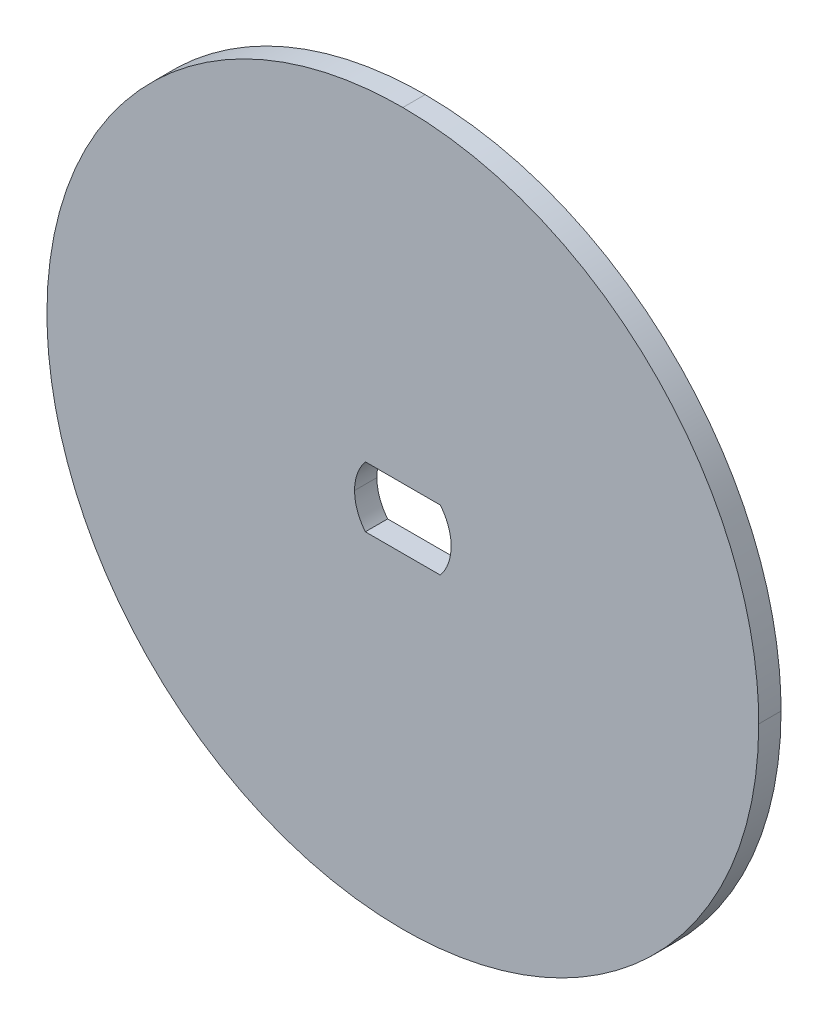
ISO-10303-21;
HEADER;
FILE_DESCRIPTION(('STEP AP214'),'2;1');
FILE_NAME('part.step','',(''),(''),'','','');
FILE_SCHEMA(('AUTOMOTIVE_DESIGN { 1 0 10303 214 1 1 1 1 }'));
ENDSEC;
DATA;
#1=APPLICATION_CONTEXT('core data for automotive mechanical design processes');
#2=APPLICATION_PROTOCOL_DEFINITION('international standard','automotive_design',2000,#1);
#3=PRODUCT_CONTEXT('',#1,'mechanical');
#4=PRODUCT('Part','Part','',(#3));
#5=PRODUCT_RELATED_PRODUCT_CATEGORY('part','',(#4));
#6=PRODUCT_DEFINITION_FORMATION('','',#4);
#7=PRODUCT_DEFINITION_CONTEXT('part definition',#1,'design');
#8=PRODUCT_DEFINITION('design','',#6,#7);
#9=PRODUCT_DEFINITION_SHAPE('','',#8);
#10=(LENGTH_UNIT() NAMED_UNIT(*) SI_UNIT(.MILLI.,.METRE.));
#11=(NAMED_UNIT(*) PLANE_ANGLE_UNIT() SI_UNIT($,.RADIAN.));
#12=(NAMED_UNIT(*) SI_UNIT($,.STERADIAN.) SOLID_ANGLE_UNIT());
#13=UNCERTAINTY_MEASURE_WITH_UNIT(LENGTH_MEASURE(1.E-05),#10,'distance_accuracy_value','');
#14=(GEOMETRIC_REPRESENTATION_CONTEXT(3) GLOBAL_UNCERTAINTY_ASSIGNED_CONTEXT((#13)) GLOBAL_UNIT_ASSIGNED_CONTEXT((#10,
#11,#12)) REPRESENTATION_CONTEXT('',''));
#15=CARTESIAN_POINT('',(0.,0.,0.));
#16=DIRECTION('',(0.,0.,1.));
#17=DIRECTION('',(1.,0.,0.));
#18=AXIS2_PLACEMENT_3D('',#15,#16,#17);
#19=CARTESIAN_POINT('',(50.012832,180.595493,1.5875));
#20=CARTESIAN_POINT('',(63.995642,180.595493,1.5875));
#21=CARTESIAN_POINT('',(75.330974,169.260162,1.5875));
#22=CARTESIAN_POINT('',(75.330974,155.277352,1.5875));
#23=B_SPLINE_CURVE_WITH_KNOTS('',3,(#19,#20,#21,#22),.UNSPECIFIED.,.F.,.F.,(4,4),(0.,1.),.UNSPECIFIED.);
#24=DIRECTION('',(0.,0.,-1.));
#25=VECTOR('',#24,1.);
#26=SURFACE_OF_LINEAR_EXTRUSION('',#23,#25);
#27=CARTESIAN_POINT('',(50.012832,180.595493,0.));
#28=CARTESIAN_POINT('',(63.995642,180.595493,0.));
#29=CARTESIAN_POINT('',(75.330974,169.260162,0.));
#30=CARTESIAN_POINT('',(75.330974,155.277352,0.));
#31=B_SPLINE_CURVE_WITH_KNOTS('',3,(#27,#28,#29,#30),.UNSPECIFIED.,.F.,.F.,(4,4),(0.,1.),.UNSPECIFIED.);
#32=CARTESIAN_POINT('',(50.012832,180.595493,0.));
#33=VERTEX_POINT('',#32);
#34=CARTESIAN_POINT('',(75.330974,155.277352,0.));
#35=VERTEX_POINT('',#34);
#36=EDGE_CURVE('E264',#33,#35,#31,.T.);
#37=ORIENTED_EDGE('',*,*,#36,.F.);
#38=DIRECTION('',(0.,0.,-1.));
#39=VECTOR('',#38,1.);
#40=CARTESIAN_POINT('',(50.012832,180.595493,1.5875));
#41=LINE('',#40,#39);
#42=CARTESIAN_POINT('',(50.012832,180.595493,1.5875));
#43=VERTEX_POINT('',#42);
#44=EDGE_CURVE('E11',#43,#33,#41,.T.);
#45=ORIENTED_EDGE('',*,*,#44,.F.);
#46=CARTESIAN_POINT('',(75.330974,155.277352,1.5875));
#47=VERTEX_POINT('',#46);
#48=EDGE_CURVE('E133',#43,#47,#23,.T.);
#49=ORIENTED_EDGE('',*,*,#48,.T.);
#50=DIRECTION('',(0.,0.,-1.));
#51=VECTOR('',#50,1.);
#52=CARTESIAN_POINT('',(75.330974,155.277352,1.5875));
#53=LINE('',#52,#51);
#54=EDGE_CURVE('E53',#47,#35,#53,.T.);
#55=ORIENTED_EDGE('',*,*,#54,.T.);
#56=EDGE_LOOP('',(#37,#45,#49,#55));
#57=FACE_BOUND('',#56,.T.);
#58=ADVANCED_FACE('F33',(#57),#26,.T.);
#59=CARTESIAN_POINT('',(24.694691,155.277352,1.5875));
#60=CARTESIAN_POINT('',(24.694691,169.260162,1.5875));
#61=CARTESIAN_POINT('',(36.029994,180.595493,1.5875));
#62=CARTESIAN_POINT('',(50.012832,180.595493,1.5875));
#63=B_SPLINE_CURVE_WITH_KNOTS('',3,(#59,#60,#61,#62),.UNSPECIFIED.,.F.,.F.,(4,4),(0.,1.),.UNSPECIFIED.);
#64=DIRECTION('',(0.,0.,-1.));
#65=VECTOR('',#64,1.);
#66=SURFACE_OF_LINEAR_EXTRUSION('',#63,#65);
#67=CARTESIAN_POINT('',(24.694691,155.277352,0.));
#68=CARTESIAN_POINT('',(24.694691,169.260162,0.));
#69=CARTESIAN_POINT('',(36.029994,180.595493,0.));
#70=CARTESIAN_POINT('',(50.012832,180.595493,0.));
#71=B_SPLINE_CURVE_WITH_KNOTS('',3,(#67,#68,#69,#70),.UNSPECIFIED.,.F.,.F.,(4,4),(0.,1.),.UNSPECIFIED.);
#72=CARTESIAN_POINT('',(24.694691,155.277352,0.));
#73=VERTEX_POINT('',#72);
#74=EDGE_CURVE('E122',#73,#33,#71,.T.);
#75=ORIENTED_EDGE('',*,*,#74,.F.);
#76=DIRECTION('',(0.,0.,-1.));
#77=VECTOR('',#76,1.);
#78=CARTESIAN_POINT('',(24.694691,155.277352,1.5875));
#79=LINE('',#78,#77);
#80=CARTESIAN_POINT('',(24.694691,155.277352,1.5875));
#81=VERTEX_POINT('',#80);
#82=EDGE_CURVE('E44',#81,#73,#79,.T.);
#83=ORIENTED_EDGE('',*,*,#82,.F.);
#84=EDGE_CURVE('E120',#81,#43,#63,.T.);
#85=ORIENTED_EDGE('',*,*,#84,.T.);
#86=ORIENTED_EDGE('',*,*,#44,.T.);
#87=EDGE_LOOP('',(#75,#83,#85,#86));
#88=FACE_BOUND('',#87,.T.);
#89=ADVANCED_FACE('F119',(#88),#66,.T.);
#90=CARTESIAN_POINT('',(50.012832,129.959211,1.5875));
#91=CARTESIAN_POINT('',(36.029994,129.959211,1.5875));
#92=CARTESIAN_POINT('',(24.694691,141.294514,1.5875));
#93=CARTESIAN_POINT('',(24.694691,155.277352,1.5875));
#94=B_SPLINE_CURVE_WITH_KNOTS('',3,(#90,#91,#92,#93),.UNSPECIFIED.,.F.,.F.,(4,4),(0.,1.),.UNSPECIFIED.);
#95=DIRECTION('',(0.,0.,-1.));
#96=VECTOR('',#95,1.);
#97=SURFACE_OF_LINEAR_EXTRUSION('',#94,#96);
#98=CARTESIAN_POINT('',(50.012832,129.959211,0.));
#99=CARTESIAN_POINT('',(36.029994,129.959211,0.));
#100=CARTESIAN_POINT('',(24.694691,141.294514,0.));
#101=CARTESIAN_POINT('',(24.694691,155.277352,0.));
#102=B_SPLINE_CURVE_WITH_KNOTS('',3,(#98,#99,#100,#101),.UNSPECIFIED.,.F.,.F.,(4,4),(0.,1.),.UNSPECIFIED.);
#103=CARTESIAN_POINT('',(50.012832,129.959211,0.));
#104=VERTEX_POINT('',#103);
#105=EDGE_CURVE('E251',#104,#73,#102,.T.);
#106=ORIENTED_EDGE('',*,*,#105,.F.);
#107=DIRECTION('',(0.,0.,-1.));
#108=VECTOR('',#107,1.);
#109=CARTESIAN_POINT('',(50.012832,129.959211,1.5875));
#110=LINE('',#109,#108);
#111=CARTESIAN_POINT('',(50.012832,129.959211,1.5875));
#112=VERTEX_POINT('',#111);
#113=EDGE_CURVE('E84',#112,#104,#110,.T.);
#114=ORIENTED_EDGE('',*,*,#113,.F.);
#115=EDGE_CURVE('E132',#112,#81,#94,.T.);
#116=ORIENTED_EDGE('',*,*,#115,.T.);
#117=ORIENTED_EDGE('',*,*,#82,.T.);
#118=EDGE_LOOP('',(#106,#114,#116,#117));
#119=FACE_BOUND('',#118,.T.);
#120=ADVANCED_FACE('F135',(#119),#97,.T.);
#121=CARTESIAN_POINT('',(53.448004,155.28176,1.5875));
#122=CARTESIAN_POINT('',(53.448004,156.099908,1.5875));
#123=CARTESIAN_POINT('',(53.158396,156.843852,1.5875));
#124=CARTESIAN_POINT('',(52.680713,157.433705,1.5875));
#125=B_SPLINE_CURVE_WITH_KNOTS('',3,(#121,#122,#123,#124),.UNSPECIFIED.,.F.,.F.,(4,4),(0.,1.),.UNSPECIFIED.);
#126=DIRECTION('',(0.,0.,-1.));
#127=VECTOR('',#126,1.);
#128=SURFACE_OF_LINEAR_EXTRUSION('',#125,#127);
#129=CARTESIAN_POINT('',(53.448004,155.28176,0.));
#130=CARTESIAN_POINT('',(53.448004,156.099908,0.));
#131=CARTESIAN_POINT('',(53.158396,156.843852,0.));
#132=CARTESIAN_POINT('',(52.680713,157.433705,0.));
#133=B_SPLINE_CURVE_WITH_KNOTS('',3,(#129,#130,#131,#132),.UNSPECIFIED.,.F.,.F.,(4,4),(0.,1.),.UNSPECIFIED.);
#134=CARTESIAN_POINT('',(53.448004,155.28176,0.));
#135=VERTEX_POINT('',#134);
#136=CARTESIAN_POINT('',(52.680713,157.433705,0.));
#137=VERTEX_POINT('',#136);
#138=EDGE_CURVE('E297',#135,#137,#133,.T.);
#139=ORIENTED_EDGE('',*,*,#138,.F.);
#140=DIRECTION('',(0.,0.,-1.));
#141=VECTOR('',#140,1.);
#142=CARTESIAN_POINT('',(53.448004,155.28176,1.5875));
#143=LINE('',#142,#141);
#144=CARTESIAN_POINT('',(53.448004,155.28176,1.5875));
#145=VERTEX_POINT('',#144);
#146=EDGE_CURVE('E38',#145,#135,#143,.T.);
#147=ORIENTED_EDGE('',*,*,#146,.F.);
#148=CARTESIAN_POINT('',(52.680713,157.433705,1.5875));
#149=VERTEX_POINT('',#148);
#150=EDGE_CURVE('E211',#145,#149,#125,.T.);
#151=ORIENTED_EDGE('',*,*,#150,.T.);
#152=DIRECTION('',(0.,0.,-1.));
#153=VECTOR('',#152,1.);
#154=CARTESIAN_POINT('',(52.680713,157.433705,1.5875));
#155=LINE('',#154,#153);
#156=EDGE_CURVE('E138',#149,#137,#155,.T.);
#157=ORIENTED_EDGE('',*,*,#156,.T.);
#158=EDGE_LOOP('',(#139,#147,#151,#157));
#159=FACE_BOUND('',#158,.T.);
#160=ADVANCED_FACE('F35',(#159),#128,.T.);
#161=CARTESIAN_POINT('',(52.680713,153.120996,1.5875));
#162=CARTESIAN_POINT('',(53.158396,153.710849,1.5875));
#163=CARTESIAN_POINT('',(53.448004,154.463612,1.5875));
#164=CARTESIAN_POINT('',(53.448004,155.28176,1.5875));
#165=B_SPLINE_CURVE_WITH_KNOTS('',3,(#161,#162,#163,#164),.UNSPECIFIED.,.F.,.F.,(4,4),(0.,1.),.UNSPECIFIED.);
#166=DIRECTION('',(0.,0.,-1.));
#167=VECTOR('',#166,1.);
#168=SURFACE_OF_LINEAR_EXTRUSION('',#165,#167);
#169=CARTESIAN_POINT('',(52.680713,153.120996,0.));
#170=CARTESIAN_POINT('',(53.158396,153.710849,0.));
#171=CARTESIAN_POINT('',(53.448004,154.463612,0.));
#172=CARTESIAN_POINT('',(53.448004,155.28176,0.));
#173=B_SPLINE_CURVE_WITH_KNOTS('',3,(#169,#170,#171,#172),.UNSPECIFIED.,.F.,.F.,(4,4),(0.,1.),.UNSPECIFIED.);
#174=CARTESIAN_POINT('',(52.680713,153.120996,0.));
#175=VERTEX_POINT('',#174);
#176=EDGE_CURVE('E293',#175,#135,#173,.T.);
#177=ORIENTED_EDGE('',*,*,#176,.F.);
#178=DIRECTION('',(0.,0.,-1.));
#179=VECTOR('',#178,1.);
#180=CARTESIAN_POINT('',(52.680713,153.120996,1.5875));
#181=LINE('',#180,#179);
#182=CARTESIAN_POINT('',(52.680713,153.120996,1.5875));
#183=VERTEX_POINT('',#182);
#184=EDGE_CURVE('E241',#183,#175,#181,.T.);
#185=ORIENTED_EDGE('',*,*,#184,.F.);
#186=EDGE_CURVE('E205',#183,#145,#165,.T.);
#187=ORIENTED_EDGE('',*,*,#186,.T.);
#188=ORIENTED_EDGE('',*,*,#146,.T.);
#189=EDGE_LOOP('',(#177,#185,#187,#188));
#190=FACE_BOUND('',#189,.T.);
#191=ADVANCED_FACE('F200',(#190),#168,.T.);
#192=CARTESIAN_POINT('',(0.,153.120996,1.5875));
#193=DIRECTION('',(0.,1.,0.));
#194=DIRECTION('',(0.,0.,1.));
#195=AXIS2_PLACEMENT_3D('',#192,#193,#194);
#196=PLANE('',#195);
#197=DIRECTION('',(1.,0.,0.));
#198=VECTOR('',#197,1.);
#199=CARTESIAN_POINT('',(0.,153.120996,0.));
#200=LINE('',#199,#198);
#201=CARTESIAN_POINT('',(47.344952,153.120996,0.));
#202=VERTEX_POINT('',#201);
#203=EDGE_CURVE('E287',#202,#175,#200,.T.);
#204=ORIENTED_EDGE('',*,*,#203,.F.);
#205=DIRECTION('',(0.,0.,-1.));
#206=VECTOR('',#205,1.);
#207=CARTESIAN_POINT('',(47.344952,153.120996,1.5875));
#208=LINE('',#207,#206);
#209=CARTESIAN_POINT('',(47.344952,153.120996,1.5875));
#210=VERTEX_POINT('',#209);
#211=EDGE_CURVE('E223',#210,#202,#208,.T.);
#212=ORIENTED_EDGE('',*,*,#211,.F.);
#213=DIRECTION('',(1.,0.,0.));
#214=VECTOR('',#213,1.);
#215=CARTESIAN_POINT('',(0.,153.120996,1.5875));
#216=LINE('',#215,#214);
#217=EDGE_CURVE('E210',#210,#183,#216,.T.);
#218=ORIENTED_EDGE('',*,*,#217,.T.);
#219=ORIENTED_EDGE('',*,*,#184,.T.);
#220=EDGE_LOOP('',(#204,#212,#218,#219));
#221=FACE_BOUND('',#220,.T.);
#222=ADVANCED_FACE('F197',(#221),#196,.T.);
#223=CARTESIAN_POINT('',(46.57766,155.28176,1.5875));
#224=CARTESIAN_POINT('',(46.57766,154.463612,1.5875));
#225=CARTESIAN_POINT('',(46.867268,153.710849,1.5875));
#226=CARTESIAN_POINT('',(47.344952,153.120996,1.5875));
#227=B_SPLINE_CURVE_WITH_KNOTS('',3,(#223,#224,#225,#226),.UNSPECIFIED.,.F.,.F.,(4,4),(0.,1.),.UNSPECIFIED.);
#228=DIRECTION('',(0.,0.,-1.));
#229=VECTOR('',#228,1.);
#230=SURFACE_OF_LINEAR_EXTRUSION('',#227,#229);
#231=CARTESIAN_POINT('',(46.57766,155.28176,0.));
#232=CARTESIAN_POINT('',(46.57766,154.463612,0.));
#233=CARTESIAN_POINT('',(46.867268,153.710849,0.));
#234=CARTESIAN_POINT('',(47.344952,153.120996,0.));
#235=B_SPLINE_CURVE_WITH_KNOTS('',3,(#231,#232,#233,#234),.UNSPECIFIED.,.F.,.F.,(4,4),(0.,1.),.UNSPECIFIED.);
#236=CARTESIAN_POINT('',(46.57766,155.28176,0.));
#237=VERTEX_POINT('',#236);
#238=EDGE_CURVE('E279',#237,#202,#235,.T.);
#239=ORIENTED_EDGE('',*,*,#238,.F.);
#240=DIRECTION('',(0.,0.,-1.));
#241=VECTOR('',#240,1.);
#242=CARTESIAN_POINT('',(46.57766,155.28176,1.5875));
#243=LINE('',#242,#241);
#244=CARTESIAN_POINT('',(46.57766,155.28176,1.5875));
#245=VERTEX_POINT('',#244);
#246=EDGE_CURVE('E225',#245,#237,#243,.T.);
#247=ORIENTED_EDGE('',*,*,#246,.F.);
#248=EDGE_CURVE('E182',#245,#210,#227,.T.);
#249=ORIENTED_EDGE('',*,*,#248,.T.);
#250=ORIENTED_EDGE('',*,*,#211,.T.);
#251=EDGE_LOOP('',(#239,#247,#249,#250));
#252=FACE_BOUND('',#251,.T.);
#253=ADVANCED_FACE('F193',(#252),#230,.T.);
#254=CARTESIAN_POINT('',(47.344952,157.433705,1.5875));
#255=CARTESIAN_POINT('',(46.867268,156.843852,1.5875));
#256=CARTESIAN_POINT('',(46.57766,156.099908,1.5875));
#257=CARTESIAN_POINT('',(46.57766,155.28176,1.5875));
#258=B_SPLINE_CURVE_WITH_KNOTS('',3,(#254,#255,#256,#257),.UNSPECIFIED.,.F.,.F.,(4,4),(0.,1.),.UNSPECIFIED.);
#259=DIRECTION('',(0.,0.,-1.));
#260=VECTOR('',#259,1.);
#261=SURFACE_OF_LINEAR_EXTRUSION('',#258,#260);
#262=CARTESIAN_POINT('',(47.344952,157.433705,0.));
#263=CARTESIAN_POINT('',(46.867268,156.843852,0.));
#264=CARTESIAN_POINT('',(46.57766,156.099908,0.));
#265=CARTESIAN_POINT('',(46.57766,155.28176,0.));
#266=B_SPLINE_CURVE_WITH_KNOTS('',3,(#262,#263,#264,#265),.UNSPECIFIED.,.F.,.F.,(4,4),(0.,1.),.UNSPECIFIED.);
#267=CARTESIAN_POINT('',(47.344952,157.433705,0.));
#268=VERTEX_POINT('',#267);
#269=EDGE_CURVE('E233',#268,#237,#266,.T.);
#270=ORIENTED_EDGE('',*,*,#269,.F.);
#271=DIRECTION('',(0.,0.,-1.));
#272=VECTOR('',#271,1.);
#273=CARTESIAN_POINT('',(47.344952,157.433705,1.5875));
#274=LINE('',#273,#272);
#275=CARTESIAN_POINT('',(47.344952,157.433705,1.5875));
#276=VERTEX_POINT('',#275);
#277=EDGE_CURVE('E231',#276,#268,#274,.T.);
#278=ORIENTED_EDGE('',*,*,#277,.F.);
#279=EDGE_CURVE('E176',#276,#245,#258,.T.);
#280=ORIENTED_EDGE('',*,*,#279,.T.);
#281=ORIENTED_EDGE('',*,*,#246,.T.);
#282=EDGE_LOOP('',(#270,#278,#280,#281));
#283=FACE_BOUND('',#282,.T.);
#284=ADVANCED_FACE('F190',(#283),#261,.T.);
#285=CARTESIAN_POINT('',(0.,157.433705,1.5875));
#286=DIRECTION('',(0.,-1.,0.));
#287=DIRECTION('',(0.,0.,-1.));
#288=AXIS2_PLACEMENT_3D('',#285,#286,#287);
#289=PLANE('',#288);
#290=DIRECTION('',(-1.,0.,0.));
#291=VECTOR('',#290,1.);
#292=CARTESIAN_POINT('',(0.,157.433705,0.));
#293=LINE('',#292,#291);
#294=EDGE_CURVE('E271',#137,#268,#293,.T.);
#295=ORIENTED_EDGE('',*,*,#294,.F.);
#296=ORIENTED_EDGE('',*,*,#156,.F.);
#297=DIRECTION('',(-1.,0.,0.));
#298=VECTOR('',#297,1.);
#299=CARTESIAN_POINT('',(0.,157.433705,1.5875));
#300=LINE('',#299,#298);
#301=EDGE_CURVE('E170',#149,#276,#300,.T.);
#302=ORIENTED_EDGE('',*,*,#301,.T.);
#303=ORIENTED_EDGE('',*,*,#277,.T.);
#304=EDGE_LOOP('',(#295,#296,#302,#303));
#305=FACE_BOUND('',#304,.T.);
#306=ADVANCED_FACE('F164',(#305),#289,.T.);
#307=CARTESIAN_POINT('',(75.330974,155.277352,1.5875));
#308=CARTESIAN_POINT('',(75.330974,141.294514,1.5875));
#309=CARTESIAN_POINT('',(63.995642,129.959211,1.5875));
#310=CARTESIAN_POINT('',(50.012832,129.959211,1.5875));
#311=B_SPLINE_CURVE_WITH_KNOTS('',3,(#307,#308,#309,#310),.UNSPECIFIED.,.F.,.F.,(4,4),(0.,1.),.UNSPECIFIED.);
#312=DIRECTION('',(0.,0.,-1.));
#313=VECTOR('',#312,1.);
#314=SURFACE_OF_LINEAR_EXTRUSION('',#311,#313);
#315=CARTESIAN_POINT('',(75.330974,155.277352,0.));
#316=CARTESIAN_POINT('',(75.330974,141.294514,0.));
#317=CARTESIAN_POINT('',(63.995642,129.959211,0.));
#318=CARTESIAN_POINT('',(50.012832,129.959211,0.));
#319=B_SPLINE_CURVE_WITH_KNOTS('',3,(#315,#316,#317,#318),.UNSPECIFIED.,.F.,.F.,(4,4),(0.,1.),.UNSPECIFIED.);
#320=EDGE_CURVE('E246',#35,#104,#319,.T.);
#321=ORIENTED_EDGE('',*,*,#320,.F.);
#322=ORIENTED_EDGE('',*,*,#54,.F.);
#323=EDGE_CURVE('E136',#47,#112,#311,.T.);
#324=ORIENTED_EDGE('',*,*,#323,.T.);
#325=ORIENTED_EDGE('',*,*,#113,.T.);
#326=EDGE_LOOP('',(#321,#322,#324,#325));
#327=FACE_BOUND('',#326,.T.);
#328=ADVANCED_FACE('F158',(#327),#314,.T.);
#329=CARTESIAN_POINT('',(0.,0.,1.5875));
#330=DIRECTION('',(0.,0.,1.));
#331=DIRECTION('',(1.,0.,0.));
#332=AXIS2_PLACEMENT_3D('',#329,#330,#331);
#333=PLANE('',#332);
#334=ORIENTED_EDGE('',*,*,#150,.F.);
#335=ORIENTED_EDGE('',*,*,#186,.F.);
#336=ORIENTED_EDGE('',*,*,#217,.F.);
#337=ORIENTED_EDGE('',*,*,#248,.F.);
#338=ORIENTED_EDGE('',*,*,#279,.F.);
#339=ORIENTED_EDGE('',*,*,#301,.F.);
#340=EDGE_LOOP('',(#334,#335,#336,#337,#338,#339));
#341=FACE_BOUND('',#340,.T.);
#342=ORIENTED_EDGE('',*,*,#48,.F.);
#343=ORIENTED_EDGE('',*,*,#84,.F.);
#344=ORIENTED_EDGE('',*,*,#115,.F.);
#345=ORIENTED_EDGE('',*,*,#323,.F.);
#346=EDGE_LOOP('',(#342,#343,#344,#345));
#347=FACE_BOUND('',#346,.T.);
#348=ADVANCED_FACE('F130',(#341,#347),#333,.T.);
#349=CARTESIAN_POINT('',(0.,0.,0.));
#350=DIRECTION('',(0.,0.,1.));
#351=DIRECTION('',(1.,0.,0.));
#352=AXIS2_PLACEMENT_3D('',#349,#350,#351);
#353=PLANE('',#352);
#354=ORIENTED_EDGE('',*,*,#138,.T.);
#355=ORIENTED_EDGE('',*,*,#294,.T.);
#356=ORIENTED_EDGE('',*,*,#269,.T.);
#357=ORIENTED_EDGE('',*,*,#238,.T.);
#358=ORIENTED_EDGE('',*,*,#203,.T.);
#359=ORIENTED_EDGE('',*,*,#176,.T.);
#360=EDGE_LOOP('',(#354,#355,#356,#357,#358,#359));
#361=FACE_BOUND('',#360,.T.);
#362=ORIENTED_EDGE('',*,*,#36,.T.);
#363=ORIENTED_EDGE('',*,*,#320,.T.);
#364=ORIENTED_EDGE('',*,*,#105,.T.);
#365=ORIENTED_EDGE('',*,*,#74,.T.);
#366=EDGE_LOOP('',(#362,#363,#364,#365));
#367=FACE_BOUND('',#366,.T.);
#368=ADVANCED_FACE('F308',(#361,#367),#353,.F.);
#369=CLOSED_SHELL('',(#58,#89,#120,#160,#191,#222,#253,#284,#306,#328,#348,#368));
#370=MANIFOLD_SOLID_BREP('B2',#369);
#371=ADVANCED_BREP_SHAPE_REPRESENTATION('',(#18,#370),#14);
#372=SHAPE_DEFINITION_REPRESENTATION(#9,#371);
ENDSEC;
END-ISO-10303-21;
